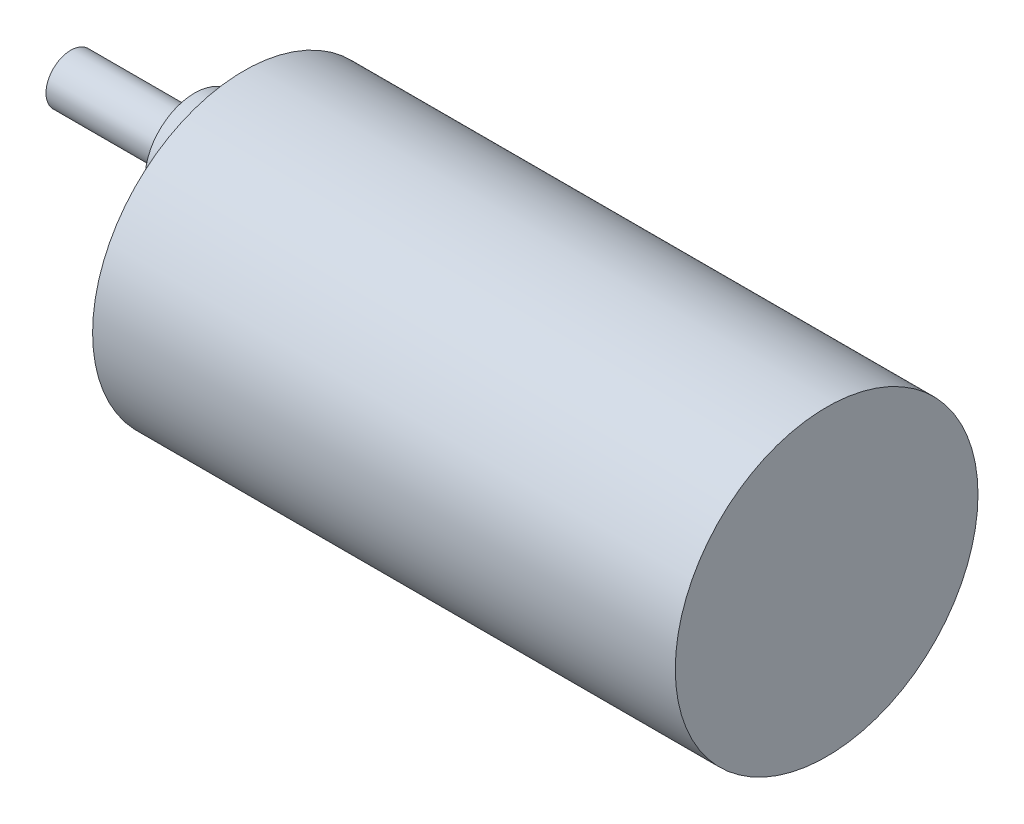
ISO-10303-21;
HEADER;
FILE_DESCRIPTION(('STEP AP214'),'2;1');
FILE_NAME('part.step','',(''),(''),'','','');
FILE_SCHEMA(('AUTOMOTIVE_DESIGN { 1 0 10303 214 1 1 1 1 }'));
ENDSEC;
DATA;
#1=APPLICATION_CONTEXT('core data for automotive mechanical design processes');
#2=APPLICATION_PROTOCOL_DEFINITION('international standard','automotive_design',2000,#1);
#3=PRODUCT_CONTEXT('',#1,'mechanical');
#4=PRODUCT('Part','Part','',(#3));
#5=PRODUCT_RELATED_PRODUCT_CATEGORY('part','',(#4));
#6=PRODUCT_DEFINITION_FORMATION('','',#4);
#7=PRODUCT_DEFINITION_CONTEXT('part definition',#1,'design');
#8=PRODUCT_DEFINITION('design','',#6,#7);
#9=PRODUCT_DEFINITION_SHAPE('','',#8);
#10=(LENGTH_UNIT() NAMED_UNIT(*) SI_UNIT(.MILLI.,.METRE.));
#11=(NAMED_UNIT(*) PLANE_ANGLE_UNIT() SI_UNIT($,.RADIAN.));
#12=(NAMED_UNIT(*) SI_UNIT($,.STERADIAN.) SOLID_ANGLE_UNIT());
#13=UNCERTAINTY_MEASURE_WITH_UNIT(LENGTH_MEASURE(1.E-05),#10,'distance_accuracy_value','');
#14=(GEOMETRIC_REPRESENTATION_CONTEXT(3) GLOBAL_UNCERTAINTY_ASSIGNED_CONTEXT((#13)) GLOBAL_UNIT_ASSIGNED_CONTEXT((#10,
#11,#12)) REPRESENTATION_CONTEXT('',''));
#15=CARTESIAN_POINT('',(0.,0.,0.));
#16=DIRECTION('',(0.,0.,1.));
#17=DIRECTION('',(1.,0.,0.));
#18=AXIS2_PLACEMENT_3D('',#15,#16,#17);
#19=CARTESIAN_POINT('',(70.64,0.,0.));
#20=DIRECTION('',(-1.,0.,0.));
#21=DIRECTION('',(0.,0.,1.));
#22=AXIS2_PLACEMENT_3D('',#19,#20,#21);
#23=CYLINDRICAL_SURFACE('',#22,18.35);
#24=CARTESIAN_POINT('',(70.64,0.,0.));
#25=DIRECTION('',(1.,0.,0.));
#26=DIRECTION('',(0.,0.,-1.));
#27=AXIS2_PLACEMENT_3D('',#24,#25,#26);
#28=CIRCLE('',#27,18.35);
#29=CARTESIAN_POINT('',(70.64,0.,-18.35));
#30=VERTEX_POINT('',#29);
#31=EDGE_CURVE('E41',#30,#30,#28,.T.);
#32=ORIENTED_EDGE('',*,*,#31,.F.);
#33=EDGE_LOOP('',(#32));
#34=FACE_BOUND('',#33,.T.);
#35=CARTESIAN_POINT('',(0.,0.,0.));
#36=DIRECTION('',(1.,0.,0.));
#37=DIRECTION('',(0.,0.,-1.));
#38=AXIS2_PLACEMENT_3D('',#35,#36,#37);
#39=CIRCLE('',#38,18.35);
#40=CARTESIAN_POINT('',(0.,0.,-18.35));
#41=VERTEX_POINT('',#40);
#42=EDGE_CURVE('E133',#41,#41,#39,.T.);
#43=ORIENTED_EDGE('',*,*,#42,.T.);
#44=EDGE_LOOP('',(#43));
#45=FACE_BOUND('',#44,.T.);
#46=ADVANCED_FACE('F34',(#34,#45),#23,.T.);
#47=CARTESIAN_POINT('',(70.64,0.,0.));
#48=DIRECTION('',(1.,0.,0.));
#49=DIRECTION('',(0.,0.,-1.));
#50=AXIS2_PLACEMENT_3D('',#47,#48,#49);
#51=PLANE('',#50);
#52=ORIENTED_EDGE('',*,*,#31,.T.);
#53=EDGE_LOOP('',(#52));
#54=FACE_BOUND('',#53,.T.);
#55=ADVANCED_FACE('F145',(#54),#51,.T.);
#56=CARTESIAN_POINT('',(0.,0.,0.));
#57=DIRECTION('',(1.,0.,0.));
#58=DIRECTION('',(0.,0.,-1.));
#59=AXIS2_PLACEMENT_3D('',#56,#57,#58);
#60=PLANE('',#59);
#61=CARTESIAN_POINT('',(0.,7.,0.));
#62=DIRECTION('',(1.,0.,0.));
#63=DIRECTION('',(0.,0.,-1.));
#64=AXIS2_PLACEMENT_3D('',#61,#62,#63);
#65=CIRCLE('',#64,6.);
#66=CARTESIAN_POINT('',(0.,7.,-6.));
#67=VERTEX_POINT('',#66);
#68=EDGE_CURVE('E11',#67,#67,#65,.F.);
#69=ORIENTED_EDGE('',*,*,#68,.F.);
#70=EDGE_LOOP('',(#69));
#71=FACE_BOUND('',#70,.T.);
#72=CARTESIAN_POINT('',(0.,-13.4233937586589,7.74999999999983));
#73=DIRECTION('',(-1.,0.,0.));
#74=DIRECTION('',(0.,0.,1.));
#75=AXIS2_PLACEMENT_3D('',#72,#73,#74);
#76=CIRCLE('',#75,1.6);
#77=CARTESIAN_POINT('',(0.,-13.4233937586589,9.34999999999983));
#78=VERTEX_POINT('',#77);
#79=EDGE_CURVE('E75',#78,#78,#76,.T.);
#80=ORIENTED_EDGE('',*,*,#79,.F.);
#81=EDGE_LOOP('',(#80));
#82=FACE_BOUND('',#81,.T.);
#83=CARTESIAN_POINT('',(0.,-1.62353882256206E-13,15.5));
#84=DIRECTION('',(-1.,0.,0.));
#85=DIRECTION('',(0.,0.,1.));
#86=AXIS2_PLACEMENT_3D('',#83,#84,#85);
#87=CIRCLE('',#86,1.6);
#88=CARTESIAN_POINT('',(0.,-1.62353882256206E-13,17.1));
#89=VERTEX_POINT('',#88);
#90=EDGE_CURVE('E125',#89,#89,#87,.T.);
#91=ORIENTED_EDGE('',*,*,#90,.F.);
#92=EDGE_LOOP('',(#91));
#93=FACE_BOUND('',#92,.T.);
#94=CARTESIAN_POINT('',(0.,7.74999999999987,13.4233937586589));
#95=DIRECTION('',(-1.,0.,0.));
#96=DIRECTION('',(0.,0.,1.));
#97=AXIS2_PLACEMENT_3D('',#94,#95,#96);
#98=CIRCLE('',#97,1.6);
#99=CARTESIAN_POINT('',(0.,7.74999999999987,15.0233937586589));
#100=VERTEX_POINT('',#99);
#101=EDGE_CURVE('E119',#100,#100,#98,.T.);
#102=ORIENTED_EDGE('',*,*,#101,.F.);
#103=EDGE_LOOP('',(#102));
#104=FACE_BOUND('',#103,.T.);
#105=CARTESIAN_POINT('',(0.,13.4233937586587,7.75000000000011));
#106=DIRECTION('',(-1.,0.,0.));
#107=DIRECTION('',(0.,0.,1.));
#108=AXIS2_PLACEMENT_3D('',#105,#106,#107);
#109=CIRCLE('',#108,1.6);
#110=CARTESIAN_POINT('',(0.,13.4233937586587,9.35000000000011));
#111=VERTEX_POINT('',#110);
#112=EDGE_CURVE('E113',#111,#111,#109,.T.);
#113=ORIENTED_EDGE('',*,*,#112,.F.);
#114=EDGE_LOOP('',(#113));
#115=FACE_BOUND('',#114,.T.);
#116=CARTESIAN_POINT('',(0.,13.4233937586588,-7.74999999999992));
#117=DIRECTION('',(-1.,0.,0.));
#118=DIRECTION('',(0.,0.,1.));
#119=AXIS2_PLACEMENT_3D('',#116,#117,#118);
#120=CIRCLE('',#119,1.6);
#121=CARTESIAN_POINT('',(0.,13.4233937586588,-6.14999999999992));
#122=VERTEX_POINT('',#121);
#123=EDGE_CURVE('E107',#122,#122,#120,.T.);
#124=ORIENTED_EDGE('',*,*,#123,.F.);
#125=EDGE_LOOP('',(#124));
#126=FACE_BOUND('',#125,.T.);
#127=CARTESIAN_POINT('',(0.,7.75000000000006,-13.4233937586588));
#128=DIRECTION('',(-1.,0.,0.));
#129=DIRECTION('',(0.,0.,1.));
#130=AXIS2_PLACEMENT_3D('',#127,#128,#129);
#131=CIRCLE('',#130,1.6);
#132=CARTESIAN_POINT('',(0.,7.75000000000006,-11.8233937586588));
#133=VERTEX_POINT('',#132);
#134=EDGE_CURVE('E101',#133,#133,#131,.T.);
#135=ORIENTED_EDGE('',*,*,#134,.F.);
#136=EDGE_LOOP('',(#135));
#137=FACE_BOUND('',#136,.T.);
#138=CARTESIAN_POINT('',(0.,0.,-15.5));
#139=DIRECTION('',(-1.,0.,0.));
#140=DIRECTION('',(0.,0.,1.));
#141=AXIS2_PLACEMENT_3D('',#138,#139,#140);
#142=CIRCLE('',#141,1.6);
#143=CARTESIAN_POINT('',(0.,0.,-13.9));
#144=VERTEX_POINT('',#143);
#145=EDGE_CURVE('E95',#144,#144,#142,.T.);
#146=ORIENTED_EDGE('',*,*,#145,.F.);
#147=EDGE_LOOP('',(#146));
#148=FACE_BOUND('',#147,.T.);
#149=CARTESIAN_POINT('',(0.,-13.4233937586588,-7.75000000000002));
#150=DIRECTION('',(-1.,0.,0.));
#151=DIRECTION('',(0.,0.,1.));
#152=AXIS2_PLACEMENT_3D('',#149,#150,#151);
#153=CIRCLE('',#152,1.6);
#154=CARTESIAN_POINT('',(0.,-13.4233937586588,-6.15000000000002));
#155=VERTEX_POINT('',#154);
#156=EDGE_CURVE('E89',#155,#155,#153,.T.);
#157=ORIENTED_EDGE('',*,*,#156,.F.);
#158=EDGE_LOOP('',(#157));
#159=FACE_BOUND('',#158,.T.);
#160=CARTESIAN_POINT('',(0.,-15.5,0.));
#161=DIRECTION('',(-1.,0.,0.));
#162=DIRECTION('',(0.,0.,1.));
#163=AXIS2_PLACEMENT_3D('',#160,#161,#162);
#164=CIRCLE('',#163,1.6);
#165=CARTESIAN_POINT('',(0.,-15.5,1.6));
#166=VERTEX_POINT('',#165);
#167=EDGE_CURVE('E88',#166,#166,#164,.T.);
#168=ORIENTED_EDGE('',*,*,#167,.F.);
#169=EDGE_LOOP('',(#168));
#170=FACE_BOUND('',#169,.T.);
#171=ORIENTED_EDGE('',*,*,#42,.F.);
#172=EDGE_LOOP('',(#171));
#173=FACE_BOUND('',#172,.T.);
#174=ADVANCED_FACE('F142',(#71,#82,#93,#104,#115,#126,#137,#148,#159,#170,#173),#60,.F.);
#175=CARTESIAN_POINT('',(10.,-15.5,0.));
#176=DIRECTION('',(-1.,0.,0.));
#177=DIRECTION('',(0.,0.,1.));
#178=AXIS2_PLACEMENT_3D('',#175,#176,#177);
#179=CYLINDRICAL_SURFACE('',#178,1.6);
#180=CARTESIAN_POINT('',(10.,-15.5,0.));
#181=DIRECTION('',(-1.,0.,0.));
#182=DIRECTION('',(0.,0.,1.));
#183=AXIS2_PLACEMENT_3D('',#180,#181,#182);
#184=CIRCLE('',#183,1.6);
#185=CARTESIAN_POINT('',(10.,-15.5,1.6));
#186=VERTEX_POINT('',#185);
#187=EDGE_CURVE('E130',#186,#186,#184,.T.);
#188=ORIENTED_EDGE('',*,*,#187,.F.);
#189=EDGE_LOOP('',(#188));
#190=FACE_BOUND('',#189,.T.);
#191=ORIENTED_EDGE('',*,*,#167,.T.);
#192=EDGE_LOOP('',(#191));
#193=FACE_BOUND('',#192,.T.);
#194=ADVANCED_FACE('F144',(#190,#193),#179,.F.);
#195=CARTESIAN_POINT('',(10.,-15.5,0.));
#196=DIRECTION('',(-1.,0.,0.));
#197=DIRECTION('',(0.,0.,1.));
#198=AXIS2_PLACEMENT_3D('',#195,#196,#197);
#199=PLANE('',#198);
#200=ORIENTED_EDGE('',*,*,#187,.T.);
#201=EDGE_LOOP('',(#200));
#202=FACE_BOUND('',#201,.T.);
#203=ADVANCED_FACE('F151',(#202),#199,.T.);
#204=CARTESIAN_POINT('',(10.,-13.4233937586588,-7.75000000000002));
#205=DIRECTION('',(-1.,0.,0.));
#206=DIRECTION('',(0.,0.,1.));
#207=AXIS2_PLACEMENT_3D('',#204,#205,#206);
#208=CYLINDRICAL_SURFACE('',#207,1.6);
#209=CARTESIAN_POINT('',(10.,-13.4233937586588,-7.75000000000002));
#210=DIRECTION('',(-1.,0.,0.));
#211=DIRECTION('',(0.,0.,1.));
#212=AXIS2_PLACEMENT_3D('',#209,#210,#211);
#213=CIRCLE('',#212,1.6);
#214=CARTESIAN_POINT('',(10.,-13.4233937586588,-6.15000000000002));
#215=VERTEX_POINT('',#214);
#216=EDGE_CURVE('E85',#215,#215,#213,.T.);
#217=ORIENTED_EDGE('',*,*,#216,.F.);
#218=EDGE_LOOP('',(#217));
#219=FACE_BOUND('',#218,.T.);
#220=ORIENTED_EDGE('',*,*,#156,.T.);
#221=EDGE_LOOP('',(#220));
#222=FACE_BOUND('',#221,.T.);
#223=ADVANCED_FACE('F183',(#219,#222),#208,.F.);
#224=CARTESIAN_POINT('',(10.,-13.4233937586588,-7.75000000000002));
#225=DIRECTION('',(-1.,0.,0.));
#226=DIRECTION('',(0.,0.,1.));
#227=AXIS2_PLACEMENT_3D('',#224,#225,#226);
#228=PLANE('',#227);
#229=ORIENTED_EDGE('',*,*,#216,.T.);
#230=EDGE_LOOP('',(#229));
#231=FACE_BOUND('',#230,.T.);
#232=ADVANCED_FACE('F193',(#231),#228,.T.);
#233=CARTESIAN_POINT('',(10.,0.,-15.5));
#234=DIRECTION('',(-1.,0.,0.));
#235=DIRECTION('',(0.,0.,1.));
#236=AXIS2_PLACEMENT_3D('',#233,#234,#235);
#237=CYLINDRICAL_SURFACE('',#236,1.6);
#238=CARTESIAN_POINT('',(10.,0.,-15.5));
#239=DIRECTION('',(-1.,0.,0.));
#240=DIRECTION('',(0.,0.,1.));
#241=AXIS2_PLACEMENT_3D('',#238,#239,#240);
#242=CIRCLE('',#241,1.6);
#243=CARTESIAN_POINT('',(10.,0.,-13.9));
#244=VERTEX_POINT('',#243);
#245=EDGE_CURVE('E92',#244,#244,#242,.T.);
#246=ORIENTED_EDGE('',*,*,#245,.F.);
#247=EDGE_LOOP('',(#246));
#248=FACE_BOUND('',#247,.T.);
#249=ORIENTED_EDGE('',*,*,#145,.T.);
#250=EDGE_LOOP('',(#249));
#251=FACE_BOUND('',#250,.T.);
#252=ADVANCED_FACE('F203',(#248,#251),#237,.F.);
#253=CARTESIAN_POINT('',(10.,0.,-15.5));
#254=DIRECTION('',(-1.,0.,0.));
#255=DIRECTION('',(0.,0.,1.));
#256=AXIS2_PLACEMENT_3D('',#253,#254,#255);
#257=PLANE('',#256);
#258=ORIENTED_EDGE('',*,*,#245,.T.);
#259=EDGE_LOOP('',(#258));
#260=FACE_BOUND('',#259,.T.);
#261=ADVANCED_FACE('F213',(#260),#257,.T.);
#262=CARTESIAN_POINT('',(10.,7.75000000000006,-13.4233937586588));
#263=DIRECTION('',(-1.,0.,0.));
#264=DIRECTION('',(0.,0.,1.));
#265=AXIS2_PLACEMENT_3D('',#262,#263,#264);
#266=CYLINDRICAL_SURFACE('',#265,1.6);
#267=CARTESIAN_POINT('',(10.,7.75000000000006,-13.4233937586588));
#268=DIRECTION('',(-1.,0.,0.));
#269=DIRECTION('',(0.,0.,1.));
#270=AXIS2_PLACEMENT_3D('',#267,#268,#269);
#271=CIRCLE('',#270,1.6);
#272=CARTESIAN_POINT('',(10.,7.75000000000006,-11.8233937586588));
#273=VERTEX_POINT('',#272);
#274=EDGE_CURVE('E98',#273,#273,#271,.T.);
#275=ORIENTED_EDGE('',*,*,#274,.F.);
#276=EDGE_LOOP('',(#275));
#277=FACE_BOUND('',#276,.T.);
#278=ORIENTED_EDGE('',*,*,#134,.T.);
#279=EDGE_LOOP('',(#278));
#280=FACE_BOUND('',#279,.T.);
#281=ADVANCED_FACE('F223',(#277,#280),#266,.F.);
#282=CARTESIAN_POINT('',(10.,7.75000000000006,-13.4233937586588));
#283=DIRECTION('',(-1.,0.,0.));
#284=DIRECTION('',(0.,0.,1.));
#285=AXIS2_PLACEMENT_3D('',#282,#283,#284);
#286=PLANE('',#285);
#287=ORIENTED_EDGE('',*,*,#274,.T.);
#288=EDGE_LOOP('',(#287));
#289=FACE_BOUND('',#288,.T.);
#290=ADVANCED_FACE('F233',(#289),#286,.T.);
#291=CARTESIAN_POINT('',(10.,13.4233937586588,-7.74999999999992));
#292=DIRECTION('',(-1.,0.,0.));
#293=DIRECTION('',(0.,0.,1.));
#294=AXIS2_PLACEMENT_3D('',#291,#292,#293);
#295=CYLINDRICAL_SURFACE('',#294,1.6);
#296=CARTESIAN_POINT('',(10.,13.4233937586588,-7.74999999999992));
#297=DIRECTION('',(-1.,0.,0.));
#298=DIRECTION('',(0.,0.,1.));
#299=AXIS2_PLACEMENT_3D('',#296,#297,#298);
#300=CIRCLE('',#299,1.6);
#301=CARTESIAN_POINT('',(10.,13.4233937586588,-6.14999999999992));
#302=VERTEX_POINT('',#301);
#303=EDGE_CURVE('E104',#302,#302,#300,.T.);
#304=ORIENTED_EDGE('',*,*,#303,.F.);
#305=EDGE_LOOP('',(#304));
#306=FACE_BOUND('',#305,.T.);
#307=ORIENTED_EDGE('',*,*,#123,.T.);
#308=EDGE_LOOP('',(#307));
#309=FACE_BOUND('',#308,.T.);
#310=ADVANCED_FACE('F243',(#306,#309),#295,.F.);
#311=CARTESIAN_POINT('',(10.,13.4233937586588,-7.74999999999992));
#312=DIRECTION('',(-1.,0.,0.));
#313=DIRECTION('',(0.,0.,1.));
#314=AXIS2_PLACEMENT_3D('',#311,#312,#313);
#315=PLANE('',#314);
#316=ORIENTED_EDGE('',*,*,#303,.T.);
#317=EDGE_LOOP('',(#316));
#318=FACE_BOUND('',#317,.T.);
#319=ADVANCED_FACE('F253',(#318),#315,.T.);
#320=CARTESIAN_POINT('',(10.,13.4233937586587,7.75000000000011));
#321=DIRECTION('',(-1.,0.,0.));
#322=DIRECTION('',(0.,0.,1.));
#323=AXIS2_PLACEMENT_3D('',#320,#321,#322);
#324=CYLINDRICAL_SURFACE('',#323,1.6);
#325=CARTESIAN_POINT('',(10.,13.4233937586587,7.75000000000011));
#326=DIRECTION('',(-1.,0.,0.));
#327=DIRECTION('',(0.,0.,1.));
#328=AXIS2_PLACEMENT_3D('',#325,#326,#327);
#329=CIRCLE('',#328,1.6);
#330=CARTESIAN_POINT('',(10.,13.4233937586587,9.35000000000011));
#331=VERTEX_POINT('',#330);
#332=EDGE_CURVE('E110',#331,#331,#329,.T.);
#333=ORIENTED_EDGE('',*,*,#332,.F.);
#334=EDGE_LOOP('',(#333));
#335=FACE_BOUND('',#334,.T.);
#336=ORIENTED_EDGE('',*,*,#112,.T.);
#337=EDGE_LOOP('',(#336));
#338=FACE_BOUND('',#337,.T.);
#339=ADVANCED_FACE('F263',(#335,#338),#324,.F.);
#340=CARTESIAN_POINT('',(10.,13.4233937586587,7.75000000000011));
#341=DIRECTION('',(-1.,0.,0.));
#342=DIRECTION('',(0.,0.,1.));
#343=AXIS2_PLACEMENT_3D('',#340,#341,#342);
#344=PLANE('',#343);
#345=ORIENTED_EDGE('',*,*,#332,.T.);
#346=EDGE_LOOP('',(#345));
#347=FACE_BOUND('',#346,.T.);
#348=ADVANCED_FACE('F273',(#347),#344,.T.);
#349=CARTESIAN_POINT('',(10.,7.74999999999987,13.4233937586589));
#350=DIRECTION('',(-1.,0.,0.));
#351=DIRECTION('',(0.,0.,1.));
#352=AXIS2_PLACEMENT_3D('',#349,#350,#351);
#353=CYLINDRICAL_SURFACE('',#352,1.6);
#354=CARTESIAN_POINT('',(10.,7.74999999999987,13.4233937586589));
#355=DIRECTION('',(-1.,0.,0.));
#356=DIRECTION('',(0.,0.,1.));
#357=AXIS2_PLACEMENT_3D('',#354,#355,#356);
#358=CIRCLE('',#357,1.6);
#359=CARTESIAN_POINT('',(10.,7.74999999999987,15.0233937586589));
#360=VERTEX_POINT('',#359);
#361=EDGE_CURVE('E116',#360,#360,#358,.T.);
#362=ORIENTED_EDGE('',*,*,#361,.F.);
#363=EDGE_LOOP('',(#362));
#364=FACE_BOUND('',#363,.T.);
#365=ORIENTED_EDGE('',*,*,#101,.T.);
#366=EDGE_LOOP('',(#365));
#367=FACE_BOUND('',#366,.T.);
#368=ADVANCED_FACE('F283',(#364,#367),#353,.F.);
#369=CARTESIAN_POINT('',(10.,7.74999999999987,13.4233937586589));
#370=DIRECTION('',(-1.,0.,0.));
#371=DIRECTION('',(0.,0.,1.));
#372=AXIS2_PLACEMENT_3D('',#369,#370,#371);
#373=PLANE('',#372);
#374=ORIENTED_EDGE('',*,*,#361,.T.);
#375=EDGE_LOOP('',(#374));
#376=FACE_BOUND('',#375,.T.);
#377=ADVANCED_FACE('F293',(#376),#373,.T.);
#378=CARTESIAN_POINT('',(10.,-1.62353882256206E-13,15.5));
#379=DIRECTION('',(-1.,0.,0.));
#380=DIRECTION('',(0.,0.,1.));
#381=AXIS2_PLACEMENT_3D('',#378,#379,#380);
#382=CYLINDRICAL_SURFACE('',#381,1.6);
#383=CARTESIAN_POINT('',(10.,-1.62353882256206E-13,15.5));
#384=DIRECTION('',(-1.,0.,0.));
#385=DIRECTION('',(0.,0.,1.));
#386=AXIS2_PLACEMENT_3D('',#383,#384,#385);
#387=CIRCLE('',#386,1.6);
#388=CARTESIAN_POINT('',(10.,-1.62353882256206E-13,17.1));
#389=VERTEX_POINT('',#388);
#390=EDGE_CURVE('E122',#389,#389,#387,.T.);
#391=ORIENTED_EDGE('',*,*,#390,.F.);
#392=EDGE_LOOP('',(#391));
#393=FACE_BOUND('',#392,.T.);
#394=ORIENTED_EDGE('',*,*,#90,.T.);
#395=EDGE_LOOP('',(#394));
#396=FACE_BOUND('',#395,.T.);
#397=ADVANCED_FACE('F303',(#393,#396),#382,.F.);
#398=CARTESIAN_POINT('',(10.,-1.62353882256206E-13,15.5));
#399=DIRECTION('',(-1.,0.,0.));
#400=DIRECTION('',(0.,0.,1.));
#401=AXIS2_PLACEMENT_3D('',#398,#399,#400);
#402=PLANE('',#401);
#403=ORIENTED_EDGE('',*,*,#390,.T.);
#404=EDGE_LOOP('',(#403));
#405=FACE_BOUND('',#404,.T.);
#406=ADVANCED_FACE('F313',(#405),#402,.T.);
#407=CARTESIAN_POINT('',(10.,-13.4233937586589,7.74999999999983));
#408=DIRECTION('',(-1.,0.,0.));
#409=DIRECTION('',(0.,0.,1.));
#410=AXIS2_PLACEMENT_3D('',#407,#408,#409);
#411=CYLINDRICAL_SURFACE('',#410,1.6);
#412=CARTESIAN_POINT('',(10.,-13.4233937586589,7.74999999999983));
#413=DIRECTION('',(-1.,0.,0.));
#414=DIRECTION('',(0.,0.,1.));
#415=AXIS2_PLACEMENT_3D('',#412,#413,#414);
#416=CIRCLE('',#415,1.6);
#417=CARTESIAN_POINT('',(10.,-13.4233937586589,9.34999999999983));
#418=VERTEX_POINT('',#417);
#419=EDGE_CURVE('E79',#418,#418,#416,.T.);
#420=ORIENTED_EDGE('',*,*,#419,.F.);
#421=EDGE_LOOP('',(#420));
#422=FACE_BOUND('',#421,.T.);
#423=ORIENTED_EDGE('',*,*,#79,.T.);
#424=EDGE_LOOP('',(#423));
#425=FACE_BOUND('',#424,.T.);
#426=ADVANCED_FACE('F323',(#422,#425),#411,.F.);
#427=CARTESIAN_POINT('',(10.,-13.4233937586589,7.74999999999983));
#428=DIRECTION('',(-1.,0.,0.));
#429=DIRECTION('',(0.,0.,1.));
#430=AXIS2_PLACEMENT_3D('',#427,#428,#429);
#431=PLANE('',#430);
#432=ORIENTED_EDGE('',*,*,#419,.T.);
#433=EDGE_LOOP('',(#432));
#434=FACE_BOUND('',#433,.T.);
#435=ADVANCED_FACE('F333',(#434),#431,.T.);
#436=CARTESIAN_POINT('',(-6.,7.,0.));
#437=DIRECTION('',(1.,0.,0.));
#438=DIRECTION('',(0.,0.,-1.));
#439=AXIS2_PLACEMENT_3D('',#436,#437,#438);
#440=CYLINDRICAL_SURFACE('',#439,6.);
#441=CARTESIAN_POINT('',(-6.,7.,0.));
#442=DIRECTION('',(-1.,0.,0.));
#443=DIRECTION('',(0.,0.,1.));
#444=AXIS2_PLACEMENT_3D('',#441,#442,#443);
#445=CIRCLE('',#444,6.);
#446=CARTESIAN_POINT('',(-6.,7.,6.));
#447=VERTEX_POINT('',#446);
#448=EDGE_CURVE('E82',#447,#447,#445,.T.);
#449=ORIENTED_EDGE('',*,*,#448,.F.);
#450=EDGE_LOOP('',(#449));
#451=FACE_BOUND('',#450,.T.);
#452=ORIENTED_EDGE('',*,*,#68,.T.);
#453=EDGE_LOOP('',(#452));
#454=FACE_BOUND('',#453,.T.);
#455=ADVANCED_FACE('F342',(#451,#454),#440,.T.);
#456=CARTESIAN_POINT('',(-6.,7.,0.));
#457=DIRECTION('',(-1.,0.,0.));
#458=DIRECTION('',(0.,0.,1.));
#459=AXIS2_PLACEMENT_3D('',#456,#457,#458);
#460=PLANE('',#459);
#461=CARTESIAN_POINT('',(-6.,7.,0.));
#462=DIRECTION('',(-1.,0.,0.));
#463=DIRECTION('',(0.,0.,1.));
#464=AXIS2_PLACEMENT_3D('',#461,#462,#463);
#465=CIRCLE('',#464,3.);
#466=CARTESIAN_POINT('',(-6.,7.,3.));
#467=VERTEX_POINT('',#466);
#468=EDGE_CURVE('E76',#467,#467,#465,.T.);
#469=ORIENTED_EDGE('',*,*,#468,.F.);
#470=EDGE_LOOP('',(#469));
#471=FACE_BOUND('',#470,.T.);
#472=ORIENTED_EDGE('',*,*,#448,.T.);
#473=EDGE_LOOP('',(#472));
#474=FACE_BOUND('',#473,.T.);
#475=ADVANCED_FACE('F357',(#471,#474),#460,.T.);
#476=CARTESIAN_POINT('',(-21.,7.,0.));
#477=DIRECTION('',(-1.,0.,0.));
#478=DIRECTION('',(0.,0.,1.));
#479=AXIS2_PLACEMENT_3D('',#476,#477,#478);
#480=PLANE('',#479);
#481=DIRECTION('',(0.,0.,-1.));
#482=VECTOR('',#481,1.);
#483=CARTESIAN_POINT('',(-21.,4.3,-1.3076696830622));
#484=LINE('',#483,#482);
#485=CARTESIAN_POINT('',(-21.,4.3,1.3076696830622));
#486=VERTEX_POINT('',#485);
#487=CARTESIAN_POINT('',(-21.,4.3,-1.3076696830622));
#488=VERTEX_POINT('',#487);
#489=EDGE_CURVE('E62',#486,#488,#484,.T.);
#490=ORIENTED_EDGE('',*,*,#489,.F.);
#491=CARTESIAN_POINT('',(-21.,7.,0.));
#492=DIRECTION('',(-1.,0.,0.));
#493=DIRECTION('',(0.,0.,1.));
#494=AXIS2_PLACEMENT_3D('',#491,#492,#493);
#495=CIRCLE('',#494,3.);
#496=EDGE_CURVE('E71',#486,#488,#495,.T.);
#497=ORIENTED_EDGE('',*,*,#496,.T.);
#498=EDGE_LOOP('',(#490,#497));
#499=FACE_BOUND('',#498,.T.);
#500=ADVANCED_FACE('F70',(#499),#480,.T.);
#501=CARTESIAN_POINT('',(-21.,7.,0.));
#502=DIRECTION('',(1.,0.,0.));
#503=DIRECTION('',(0.,0.,-1.));
#504=AXIS2_PLACEMENT_3D('',#501,#502,#503);
#505=CYLINDRICAL_SURFACE('',#504,3.);
#506=ORIENTED_EDGE('',*,*,#496,.F.);
#507=DIRECTION('',(-1.,0.,0.));
#508=VECTOR('',#507,1.);
#509=CARTESIAN_POINT('',(-9.2,4.3,1.3076696830622));
#510=LINE('',#509,#508);
#511=CARTESIAN_POINT('',(-9.2,4.3,1.3076696830622));
#512=VERTEX_POINT('',#511);
#513=EDGE_CURVE('E59',#512,#486,#510,.T.);
#514=ORIENTED_EDGE('',*,*,#513,.F.);
#515=CARTESIAN_POINT('',(-9.2,7.,0.));
#516=DIRECTION('',(-1.,0.,0.));
#517=DIRECTION('',(0.,0.,1.));
#518=AXIS2_PLACEMENT_3D('',#515,#516,#517);
#519=CIRCLE('',#518,3.);
#520=CARTESIAN_POINT('',(-9.2,4.3,-1.3076696830622));
#521=VERTEX_POINT('',#520);
#522=EDGE_CURVE('E52',#521,#512,#519,.T.);
#523=ORIENTED_EDGE('',*,*,#522,.F.);
#524=DIRECTION('',(-1.,0.,0.));
#525=VECTOR('',#524,1.);
#526=CARTESIAN_POINT('',(-9.2,4.3,-1.3076696830622));
#527=LINE('',#526,#525);
#528=EDGE_CURVE('E66',#521,#488,#527,.T.);
#529=ORIENTED_EDGE('',*,*,#528,.T.);
#530=EDGE_LOOP('',(#506,#514,#523,#529));
#531=FACE_BOUND('',#530,.T.);
#532=ORIENTED_EDGE('',*,*,#468,.T.);
#533=EDGE_LOOP('',(#532));
#534=FACE_BOUND('',#533,.T.);
#535=ADVANCED_FACE('F73',(#531,#534),#505,.T.);
#536=CARTESIAN_POINT('',(-9.2,4.3,-1.3076696830622));
#537=DIRECTION('',(0.,1.,0.));
#538=DIRECTION('',(0.,0.,1.));
#539=AXIS2_PLACEMENT_3D('',#536,#537,#538);
#540=PLANE('',#539);
#541=ORIENTED_EDGE('',*,*,#489,.T.);
#542=ORIENTED_EDGE('',*,*,#528,.F.);
#543=DIRECTION('',(0.,0.,-1.));
#544=VECTOR('',#543,1.);
#545=CARTESIAN_POINT('',(-9.2,4.3,-1.3076696830622));
#546=LINE('',#545,#544);
#547=EDGE_CURVE('E47',#512,#521,#546,.T.);
#548=ORIENTED_EDGE('',*,*,#547,.F.);
#549=ORIENTED_EDGE('',*,*,#513,.T.);
#550=EDGE_LOOP('',(#541,#542,#548,#549));
#551=FACE_BOUND('',#550,.T.);
#552=ADVANCED_FACE('F61',(#551),#540,.F.);
#553=CARTESIAN_POINT('',(-9.2,7.,0.));
#554=DIRECTION('',(-1.,0.,0.));
#555=DIRECTION('',(0.,0.,1.));
#556=AXIS2_PLACEMENT_3D('',#553,#554,#555);
#557=PLANE('',#556);
#558=ORIENTED_EDGE('',*,*,#522,.T.);
#559=ORIENTED_EDGE('',*,*,#547,.T.);
#560=EDGE_LOOP('',(#558,#559));
#561=FACE_BOUND('',#560,.T.);
#562=ADVANCED_FACE('F391',(#561),#557,.T.);
#563=CLOSED_SHELL('',(#46,#55,#174,#194,#203,#223,#232,#252,#261,#281,#290,#310,#319,#339,#348,
#368,#377,#397,#406,#426,#435,#455,#475,#500,#535,#552,#562));
#564=MANIFOLD_SOLID_BREP('B2',#563);
#565=ADVANCED_BREP_SHAPE_REPRESENTATION('',(#18,#564),#14);
#566=SHAPE_DEFINITION_REPRESENTATION(#9,#565);
ENDSEC;
END-ISO-10303-21;
